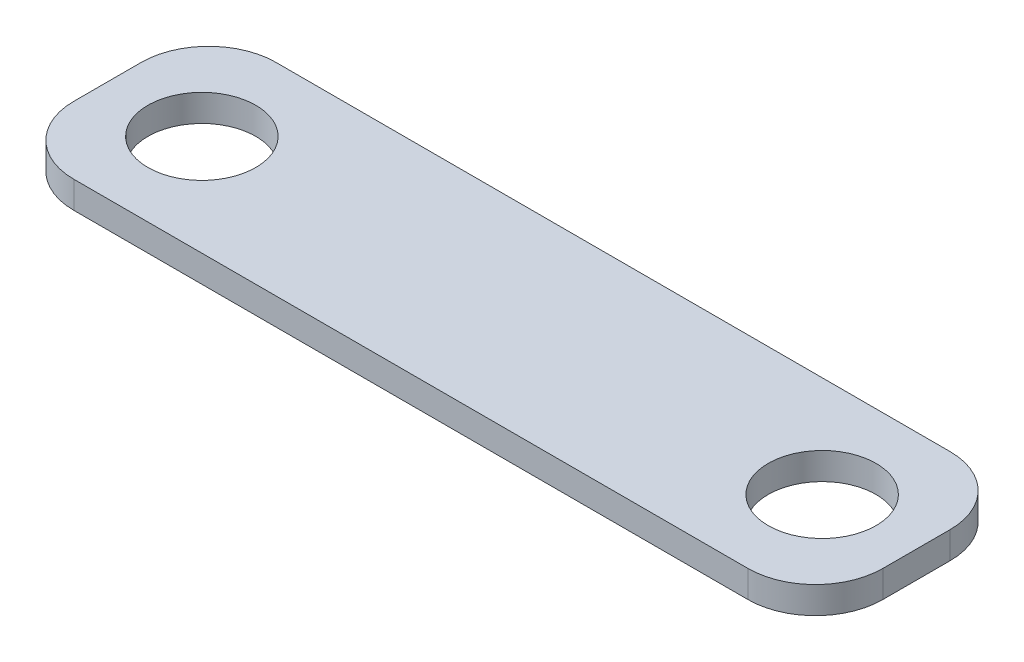
ISO-10303-21;
HEADER;
FILE_DESCRIPTION(('STEP AP214'),'2;1');
FILE_NAME('part.step','',(''),(''),'','','');
FILE_SCHEMA(('AUTOMOTIVE_DESIGN { 1 0 10303 214 1 1 1 1 }'));
ENDSEC;
DATA;
#1=APPLICATION_CONTEXT('core data for automotive mechanical design processes');
#2=APPLICATION_PROTOCOL_DEFINITION('international standard','automotive_design',2000,#1);
#3=PRODUCT_CONTEXT('',#1,'mechanical');
#4=PRODUCT('Part','Part','',(#3));
#5=PRODUCT_RELATED_PRODUCT_CATEGORY('part','',(#4));
#6=PRODUCT_DEFINITION_FORMATION('','',#4);
#7=PRODUCT_DEFINITION_CONTEXT('part definition',#1,'design');
#8=PRODUCT_DEFINITION('design','',#6,#7);
#9=PRODUCT_DEFINITION_SHAPE('','',#8);
#10=(LENGTH_UNIT() NAMED_UNIT(*) SI_UNIT(.MILLI.,.METRE.));
#11=(NAMED_UNIT(*) PLANE_ANGLE_UNIT() SI_UNIT($,.RADIAN.));
#12=(NAMED_UNIT(*) SI_UNIT($,.STERADIAN.) SOLID_ANGLE_UNIT());
#13=UNCERTAINTY_MEASURE_WITH_UNIT(LENGTH_MEASURE(1.E-05),#10,'distance_accuracy_value','');
#14=(GEOMETRIC_REPRESENTATION_CONTEXT(3) GLOBAL_UNCERTAINTY_ASSIGNED_CONTEXT((#13)) GLOBAL_UNIT_ASSIGNED_CONTEXT((#10,
#11,#12)) REPRESENTATION_CONTEXT('',''));
#15=CARTESIAN_POINT('',(0.,0.,0.));
#16=DIRECTION('',(0.,0.,1.));
#17=DIRECTION('',(1.,0.,0.));
#18=AXIS2_PLACEMENT_3D('',#15,#16,#17);
#19=CARTESIAN_POINT('',(0.,2.,0.));
#20=DIRECTION('',(0.,-1.,0.));
#21=DIRECTION('',(0.,0.,-1.));
#22=AXIS2_PLACEMENT_3D('',#19,#20,#21);
#23=PLANE('',#22);
#24=DIRECTION('',(0.,0.,-1.));
#25=VECTOR('',#24,1.);
#26=CARTESIAN_POINT('',(60.,2.,-1.70305676855895));
#27=LINE('',#26,#25);
#28=CARTESIAN_POINT('',(60.,2.,-6.70305676855895));
#29=VERTEX_POINT('',#28);
#30=CARTESIAN_POINT('',(60.,2.,-11.7030567685589));
#31=VERTEX_POINT('',#30);
#32=EDGE_CURVE('E200',#29,#31,#27,.T.);
#33=ORIENTED_EDGE('',*,*,#32,.T.);
#34=CARTESIAN_POINT('',(55.,2.,-11.7030567685589));
#35=DIRECTION('',(0.,-1.,0.));
#36=DIRECTION('',(0.,0.,-1.));
#37=AXIS2_PLACEMENT_3D('',#34,#35,#36);
#38=CIRCLE('',#37,5.);
#39=CARTESIAN_POINT('',(55.,2.,-16.703056768559));
#40=VERTEX_POINT('',#39);
#41=EDGE_CURVE('E169',#31,#40,#38,.F.);
#42=ORIENTED_EDGE('',*,*,#41,.T.);
#43=DIRECTION('',(-1.,0.,0.));
#44=VECTOR('',#43,1.);
#45=CARTESIAN_POINT('',(0.,2.,-16.703056768559));
#46=LINE('',#45,#44);
#47=CARTESIAN_POINT('',(5.,2.,-16.703056768559));
#48=VERTEX_POINT('',#47);
#49=EDGE_CURVE('E127',#40,#48,#46,.T.);
#50=ORIENTED_EDGE('',*,*,#49,.T.);
#51=CARTESIAN_POINT('',(5.,2.,-11.7030567685589));
#52=DIRECTION('',(0.,-1.,0.));
#53=DIRECTION('',(0.,0.,-1.));
#54=AXIS2_PLACEMENT_3D('',#51,#52,#53);
#55=CIRCLE('',#54,5.);
#56=CARTESIAN_POINT('',(0.,2.,-11.7030567685589));
#57=VERTEX_POINT('',#56);
#58=EDGE_CURVE('E161',#48,#57,#55,.F.);
#59=ORIENTED_EDGE('',*,*,#58,.T.);
#60=DIRECTION('',(0.,0.,1.));
#61=VECTOR('',#60,1.);
#62=CARTESIAN_POINT('',(0.,2.,-1.70305676855895));
#63=LINE('',#62,#61);
#64=CARTESIAN_POINT('',(0.,2.,-6.70305676855895));
#65=VERTEX_POINT('',#64);
#66=EDGE_CURVE('E136',#57,#65,#63,.T.);
#67=ORIENTED_EDGE('',*,*,#66,.T.);
#68=CARTESIAN_POINT('',(5.,2.,-6.70305676855895));
#69=DIRECTION('',(0.,-1.,0.));
#70=DIRECTION('',(0.,0.,-1.));
#71=AXIS2_PLACEMENT_3D('',#68,#69,#70);
#72=CIRCLE('',#71,5.);
#73=CARTESIAN_POINT('',(5.,2.,-1.70305676855895));
#74=VERTEX_POINT('',#73);
#75=EDGE_CURVE('E62',#65,#74,#72,.F.);
#76=ORIENTED_EDGE('',*,*,#75,.T.);
#77=DIRECTION('',(1.,0.,0.));
#78=VECTOR('',#77,1.);
#79=CARTESIAN_POINT('',(0.,2.,-1.70305676855895));
#80=LINE('',#79,#78);
#81=CARTESIAN_POINT('',(55.,2.,-1.70305676855895));
#82=VERTEX_POINT('',#81);
#83=EDGE_CURVE('E141',#74,#82,#80,.T.);
#84=ORIENTED_EDGE('',*,*,#83,.T.);
#85=CARTESIAN_POINT('',(55.,2.,-6.70305676855895));
#86=DIRECTION('',(0.,-1.,0.));
#87=DIRECTION('',(0.,0.,-1.));
#88=AXIS2_PLACEMENT_3D('',#85,#86,#87);
#89=CIRCLE('',#88,5.);
#90=EDGE_CURVE('E166',#82,#29,#89,.F.);
#91=ORIENTED_EDGE('',*,*,#90,.T.);
#92=EDGE_LOOP('',(#33,#42,#50,#59,#67,#76,#84,#91));
#93=FACE_BOUND('',#92,.T.);
#94=CARTESIAN_POINT('',(53.,2.,-9.20305676855895));
#95=DIRECTION('',(0.,1.,0.));
#96=DIRECTION('',(0.,0.,1.));
#97=AXIS2_PLACEMENT_3D('',#94,#95,#96);
#98=CIRCLE('',#97,4.);
#99=CARTESIAN_POINT('',(53.,2.,-5.20305676855895));
#100=VERTEX_POINT('',#99);
#101=EDGE_CURVE('E206',#100,#100,#98,.F.);
#102=ORIENTED_EDGE('',*,*,#101,.T.);
#103=EDGE_LOOP('',(#102));
#104=FACE_BOUND('',#103,.T.);
#105=CARTESIAN_POINT('',(7.,2.,-9.20305676855895));
#106=DIRECTION('',(0.,1.,0.));
#107=DIRECTION('',(0.,0.,1.));
#108=AXIS2_PLACEMENT_3D('',#105,#106,#107);
#109=CIRCLE('',#108,4.);
#110=CARTESIAN_POINT('',(7.,2.,-5.20305676855895));
#111=VERTEX_POINT('',#110);
#112=EDGE_CURVE('E195',#111,#111,#109,.T.);
#113=ORIENTED_EDGE('',*,*,#112,.F.);
#114=EDGE_LOOP('',(#113));
#115=FACE_BOUND('',#114,.T.);
#116=ADVANCED_FACE('F39',(#93,#104,#115),#23,.F.);
#117=CARTESIAN_POINT('',(0.,0.,0.));
#118=DIRECTION('',(0.,-1.,0.));
#119=DIRECTION('',(0.,0.,-1.));
#120=AXIS2_PLACEMENT_3D('',#117,#118,#119);
#121=PLANE('',#120);
#122=CARTESIAN_POINT('',(53.,0.,-9.20305676855895));
#123=DIRECTION('',(0.,1.,0.));
#124=DIRECTION('',(0.,0.,1.));
#125=AXIS2_PLACEMENT_3D('',#122,#123,#124);
#126=CIRCLE('',#125,4.);
#127=CARTESIAN_POINT('',(53.,0.,-5.20305676855895));
#128=VERTEX_POINT('',#127);
#129=EDGE_CURVE('E210',#128,#128,#126,.F.);
#130=ORIENTED_EDGE('',*,*,#129,.F.);
#131=EDGE_LOOP('',(#130));
#132=FACE_BOUND('',#131,.T.);
#133=DIRECTION('',(-1.,0.,0.));
#134=VECTOR('',#133,1.);
#135=CARTESIAN_POINT('',(0.,0.,-16.703056768559));
#136=LINE('',#135,#134);
#137=CARTESIAN_POINT('',(55.,0.,-16.703056768559));
#138=VERTEX_POINT('',#137);
#139=CARTESIAN_POINT('',(5.,0.,-16.703056768559));
#140=VERTEX_POINT('',#139);
#141=EDGE_CURVE('E124',#138,#140,#136,.T.);
#142=ORIENTED_EDGE('',*,*,#141,.F.);
#143=CARTESIAN_POINT('',(55.,0.,-11.7030567685589));
#144=DIRECTION('',(0.,-1.,0.));
#145=DIRECTION('',(0.,0.,-1.));
#146=AXIS2_PLACEMENT_3D('',#143,#144,#145);
#147=CIRCLE('',#146,5.);
#148=CARTESIAN_POINT('',(60.,0.,-11.7030567685589));
#149=VERTEX_POINT('',#148);
#150=EDGE_CURVE('E106',#138,#149,#147,.T.);
#151=ORIENTED_EDGE('',*,*,#150,.T.);
#152=DIRECTION('',(0.,0.,-1.));
#153=VECTOR('',#152,1.);
#154=CARTESIAN_POINT('',(60.,0.,-1.70305676855895));
#155=LINE('',#154,#153);
#156=CARTESIAN_POINT('',(60.,0.,-6.70305676855895));
#157=VERTEX_POINT('',#156);
#158=EDGE_CURVE('E137',#157,#149,#155,.T.);
#159=ORIENTED_EDGE('',*,*,#158,.F.);
#160=CARTESIAN_POINT('',(55.,0.,-6.70305676855895));
#161=DIRECTION('',(0.,-1.,0.));
#162=DIRECTION('',(0.,0.,-1.));
#163=AXIS2_PLACEMENT_3D('',#160,#161,#162);
#164=CIRCLE('',#163,5.);
#165=CARTESIAN_POINT('',(55.,0.,-1.70305676855895));
#166=VERTEX_POINT('',#165);
#167=EDGE_CURVE('E118',#157,#166,#164,.T.);
#168=ORIENTED_EDGE('',*,*,#167,.T.);
#169=DIRECTION('',(1.,0.,0.));
#170=VECTOR('',#169,1.);
#171=CARTESIAN_POINT('',(0.,0.,-1.70305676855895));
#172=LINE('',#171,#170);
#173=CARTESIAN_POINT('',(5.,0.,-1.70305676855895));
#174=VERTEX_POINT('',#173);
#175=EDGE_CURVE('E143',#174,#166,#172,.T.);
#176=ORIENTED_EDGE('',*,*,#175,.F.);
#177=CARTESIAN_POINT('',(5.,0.,-6.70305676855895));
#178=DIRECTION('',(0.,-1.,0.));
#179=DIRECTION('',(0.,0.,-1.));
#180=AXIS2_PLACEMENT_3D('',#177,#178,#179);
#181=CIRCLE('',#180,5.);
#182=CARTESIAN_POINT('',(0.,0.,-6.70305676855895));
#183=VERTEX_POINT('',#182);
#184=EDGE_CURVE('E151',#174,#183,#181,.T.);
#185=ORIENTED_EDGE('',*,*,#184,.T.);
#186=DIRECTION('',(0.,0.,1.));
#187=VECTOR('',#186,1.);
#188=CARTESIAN_POINT('',(0.,0.,-1.70305676855895));
#189=LINE('',#188,#187);
#190=CARTESIAN_POINT('',(0.,0.,-11.7030567685589));
#191=VERTEX_POINT('',#190);
#192=EDGE_CURVE('E184',#191,#183,#189,.T.);
#193=ORIENTED_EDGE('',*,*,#192,.F.);
#194=CARTESIAN_POINT('',(5.,0.,-11.7030567685589));
#195=DIRECTION('',(0.,-1.,0.));
#196=DIRECTION('',(0.,0.,-1.));
#197=AXIS2_PLACEMENT_3D('',#194,#195,#196);
#198=CIRCLE('',#197,5.);
#199=EDGE_CURVE('E129',#191,#140,#198,.T.);
#200=ORIENTED_EDGE('',*,*,#199,.T.);
#201=EDGE_LOOP('',(#142,#151,#159,#168,#176,#185,#193,#200));
#202=FACE_BOUND('',#201,.T.);
#203=CARTESIAN_POINT('',(7.,0.,-9.20305676855895));
#204=DIRECTION('',(0.,1.,0.));
#205=DIRECTION('',(0.,0.,1.));
#206=AXIS2_PLACEMENT_3D('',#203,#204,#205);
#207=CIRCLE('',#206,4.);
#208=CARTESIAN_POINT('',(7.,0.,-5.20305676855895));
#209=VERTEX_POINT('',#208);
#210=EDGE_CURVE('E190',#209,#209,#207,.T.);
#211=ORIENTED_EDGE('',*,*,#210,.T.);
#212=EDGE_LOOP('',(#211));
#213=FACE_BOUND('',#212,.T.);
#214=ADVANCED_FACE('F132',(#132,#202,#213),#121,.T.);
#215=CARTESIAN_POINT('',(0.,2.,-1.70305676855895));
#216=DIRECTION('',(1.,0.,0.));
#217=DIRECTION('',(0.,0.,-1.));
#218=AXIS2_PLACEMENT_3D('',#215,#216,#217);
#219=PLANE('',#218);
#220=ORIENTED_EDGE('',*,*,#192,.T.);
#221=DIRECTION('',(0.,-1.,0.));
#222=VECTOR('',#221,1.);
#223=CARTESIAN_POINT('',(0.,2.,-6.70305676855895));
#224=LINE('',#223,#222);
#225=EDGE_CURVE('E11',#183,#65,#224,.F.);
#226=ORIENTED_EDGE('',*,*,#225,.T.);
#227=ORIENTED_EDGE('',*,*,#66,.F.);
#228=DIRECTION('',(0.,-1.,0.));
#229=VECTOR('',#228,1.);
#230=CARTESIAN_POINT('',(0.,2.,-11.7030567685589));
#231=LINE('',#230,#229);
#232=EDGE_CURVE('E48',#57,#191,#231,.T.);
#233=ORIENTED_EDGE('',*,*,#232,.T.);
#234=EDGE_LOOP('',(#220,#226,#227,#233));
#235=FACE_BOUND('',#234,.T.);
#236=ADVANCED_FACE('F183',(#235),#219,.F.);
#237=CARTESIAN_POINT('',(0.,2.,-1.70305676855895));
#238=DIRECTION('',(0.,0.,-1.));
#239=DIRECTION('',(-1.,0.,0.));
#240=AXIS2_PLACEMENT_3D('',#237,#238,#239);
#241=PLANE('',#240);
#242=ORIENTED_EDGE('',*,*,#175,.T.);
#243=DIRECTION('',(0.,-1.,0.));
#244=VECTOR('',#243,1.);
#245=CARTESIAN_POINT('',(55.,2.,-1.70305676855895));
#246=LINE('',#245,#244);
#247=EDGE_CURVE('E55',#166,#82,#246,.F.);
#248=ORIENTED_EDGE('',*,*,#247,.T.);
#249=ORIENTED_EDGE('',*,*,#83,.F.);
#250=DIRECTION('',(0.,-1.,0.));
#251=VECTOR('',#250,1.);
#252=CARTESIAN_POINT('',(5.,2.,-1.70305676855895));
#253=LINE('',#252,#251);
#254=EDGE_CURVE('E172',#74,#174,#253,.T.);
#255=ORIENTED_EDGE('',*,*,#254,.T.);
#256=EDGE_LOOP('',(#242,#248,#249,#255));
#257=FACE_BOUND('',#256,.T.);
#258=ADVANCED_FACE('F237',(#257),#241,.F.);
#259=CARTESIAN_POINT('',(60.,2.,-1.70305676855895));
#260=DIRECTION('',(-1.,0.,0.));
#261=DIRECTION('',(0.,0.,1.));
#262=AXIS2_PLACEMENT_3D('',#259,#260,#261);
#263=PLANE('',#262);
#264=ORIENTED_EDGE('',*,*,#158,.T.);
#265=DIRECTION('',(0.,-1.,0.));
#266=VECTOR('',#265,1.);
#267=CARTESIAN_POINT('',(60.,2.,-11.7030567685589));
#268=LINE('',#267,#266);
#269=EDGE_CURVE('E111',#149,#31,#268,.F.);
#270=ORIENTED_EDGE('',*,*,#269,.T.);
#271=ORIENTED_EDGE('',*,*,#32,.F.);
#272=DIRECTION('',(0.,-1.,0.));
#273=VECTOR('',#272,1.);
#274=CARTESIAN_POINT('',(60.,2.,-6.70305676855895));
#275=LINE('',#274,#273);
#276=EDGE_CURVE('E117',#29,#157,#275,.T.);
#277=ORIENTED_EDGE('',*,*,#276,.T.);
#278=EDGE_LOOP('',(#264,#270,#271,#277));
#279=FACE_BOUND('',#278,.T.);
#280=ADVANCED_FACE('F234',(#279),#263,.F.);
#281=CARTESIAN_POINT('',(0.,2.,-16.703056768559));
#282=DIRECTION('',(0.,0.,1.));
#283=DIRECTION('',(1.,0.,0.));
#284=AXIS2_PLACEMENT_3D('',#281,#282,#283);
#285=PLANE('',#284);
#286=ORIENTED_EDGE('',*,*,#49,.F.);
#287=DIRECTION('',(0.,-1.,0.));
#288=VECTOR('',#287,1.);
#289=CARTESIAN_POINT('',(55.,2.,-16.703056768559));
#290=LINE('',#289,#288);
#291=EDGE_CURVE('E110',#40,#138,#290,.T.);
#292=ORIENTED_EDGE('',*,*,#291,.T.);
#293=ORIENTED_EDGE('',*,*,#141,.T.);
#294=DIRECTION('',(0.,-1.,0.));
#295=VECTOR('',#294,1.);
#296=CARTESIAN_POINT('',(5.,2.,-16.703056768559));
#297=LINE('',#296,#295);
#298=EDGE_CURVE('E130',#140,#48,#297,.F.);
#299=ORIENTED_EDGE('',*,*,#298,.T.);
#300=EDGE_LOOP('',(#286,#292,#293,#299));
#301=FACE_BOUND('',#300,.T.);
#302=ADVANCED_FACE('F123',(#301),#285,.F.);
#303=CARTESIAN_POINT('',(53.,0.,-9.20305676855895));
#304=DIRECTION('',(0.,1.,0.));
#305=DIRECTION('',(0.,0.,1.));
#306=AXIS2_PLACEMENT_3D('',#303,#304,#305);
#307=CYLINDRICAL_SURFACE('',#306,4.);
#308=ORIENTED_EDGE('',*,*,#129,.T.);
#309=EDGE_LOOP('',(#308));
#310=FACE_BOUND('',#309,.T.);
#311=ORIENTED_EDGE('',*,*,#101,.F.);
#312=EDGE_LOOP('',(#311));
#313=FACE_BOUND('',#312,.T.);
#314=ADVANCED_FACE('F229',(#310,#313),#307,.F.);
#315=CARTESIAN_POINT('',(7.,0.,-9.20305676855895));
#316=DIRECTION('',(0.,1.,0.));
#317=DIRECTION('',(0.,0.,1.));
#318=AXIS2_PLACEMENT_3D('',#315,#316,#317);
#319=CYLINDRICAL_SURFACE('',#318,4.);
#320=ORIENTED_EDGE('',*,*,#210,.F.);
#321=EDGE_LOOP('',(#320));
#322=FACE_BOUND('',#321,.T.);
#323=ORIENTED_EDGE('',*,*,#112,.T.);
#324=EDGE_LOOP('',(#323));
#325=FACE_BOUND('',#324,.T.);
#326=ADVANCED_FACE('F218',(#322,#325),#319,.F.);
#327=CARTESIAN_POINT('',(55.,2.,-11.7030567685589));
#328=DIRECTION('',(0.,-1.,0.));
#329=DIRECTION('',(0.,0.,-1.));
#330=AXIS2_PLACEMENT_3D('',#327,#328,#329);
#331=CYLINDRICAL_SURFACE('',#330,5.);
#332=ORIENTED_EDGE('',*,*,#41,.F.);
#333=ORIENTED_EDGE('',*,*,#269,.F.);
#334=ORIENTED_EDGE('',*,*,#150,.F.);
#335=ORIENTED_EDGE('',*,*,#291,.F.);
#336=EDGE_LOOP('',(#332,#333,#334,#335));
#337=FACE_BOUND('',#336,.T.);
#338=ADVANCED_FACE('F109',(#337),#331,.T.);
#339=CARTESIAN_POINT('',(55.,2.,-6.70305676855895));
#340=DIRECTION('',(0.,-1.,0.));
#341=DIRECTION('',(0.,0.,-1.));
#342=AXIS2_PLACEMENT_3D('',#339,#340,#341);
#343=CYLINDRICAL_SURFACE('',#342,5.);
#344=ORIENTED_EDGE('',*,*,#90,.F.);
#345=ORIENTED_EDGE('',*,*,#247,.F.);
#346=ORIENTED_EDGE('',*,*,#167,.F.);
#347=ORIENTED_EDGE('',*,*,#276,.F.);
#348=EDGE_LOOP('',(#344,#345,#346,#347));
#349=FACE_BOUND('',#348,.T.);
#350=ADVANCED_FACE('F245',(#349),#343,.T.);
#351=CARTESIAN_POINT('',(5.,2.,-6.70305676855895));
#352=DIRECTION('',(0.,-1.,0.));
#353=DIRECTION('',(0.,0.,-1.));
#354=AXIS2_PLACEMENT_3D('',#351,#352,#353);
#355=CYLINDRICAL_SURFACE('',#354,5.);
#356=ORIENTED_EDGE('',*,*,#75,.F.);
#357=ORIENTED_EDGE('',*,*,#225,.F.);
#358=ORIENTED_EDGE('',*,*,#184,.F.);
#359=ORIENTED_EDGE('',*,*,#254,.F.);
#360=EDGE_LOOP('',(#356,#357,#358,#359));
#361=FACE_BOUND('',#360,.T.);
#362=ADVANCED_FACE('F247',(#361),#355,.T.);
#363=CARTESIAN_POINT('',(5.,2.,-11.7030567685589));
#364=DIRECTION('',(0.,-1.,0.));
#365=DIRECTION('',(0.,0.,-1.));
#366=AXIS2_PLACEMENT_3D('',#363,#364,#365);
#367=CYLINDRICAL_SURFACE('',#366,5.);
#368=ORIENTED_EDGE('',*,*,#58,.F.);
#369=ORIENTED_EDGE('',*,*,#298,.F.);
#370=ORIENTED_EDGE('',*,*,#199,.F.);
#371=ORIENTED_EDGE('',*,*,#232,.F.);
#372=EDGE_LOOP('',(#368,#369,#370,#371));
#373=FACE_BOUND('',#372,.T.);
#374=ADVANCED_FACE('F41',(#373),#367,.T.);
#375=CLOSED_SHELL('',(#116,#214,#236,#258,#280,#302,#314,#326,#338,#350,#362,#374));
#376=MANIFOLD_SOLID_BREP('B2',#375);
#377=ADVANCED_BREP_SHAPE_REPRESENTATION('',(#18,#376),#14);
#378=SHAPE_DEFINITION_REPRESENTATION(#9,#377);
ENDSEC;
END-ISO-10303-21;
